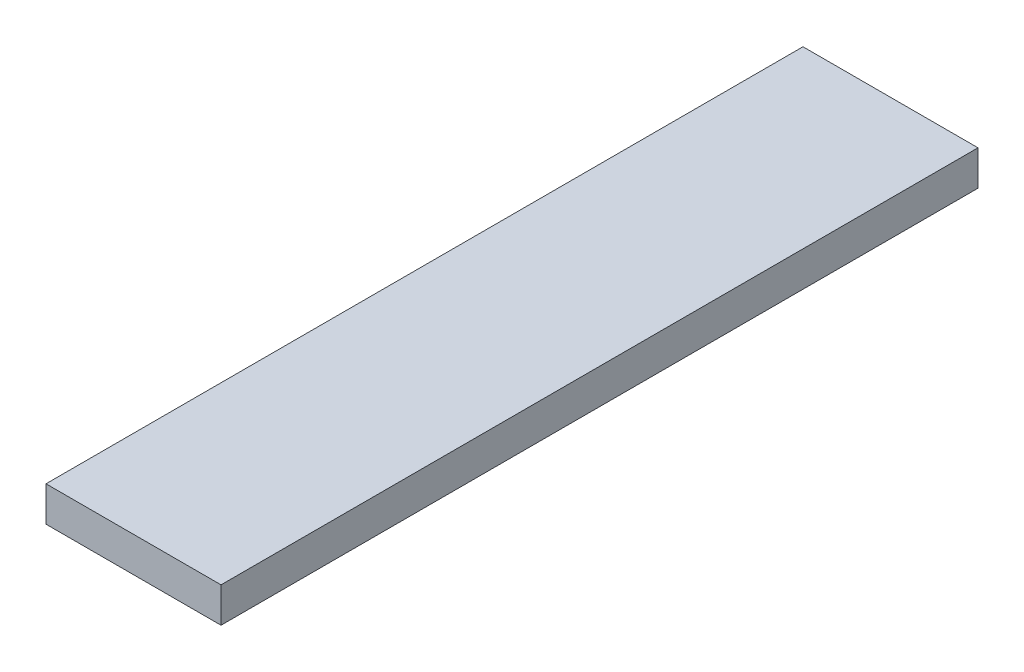
ISO-10303-21;
HEADER;
FILE_DESCRIPTION(('STEP AP214'),'2;1');
FILE_NAME('part.step','',(''),(''),'','','');
FILE_SCHEMA(('AUTOMOTIVE_DESIGN { 1 0 10303 214 1 1 1 1 }'));
ENDSEC;
DATA;
#1=APPLICATION_CONTEXT('core data for automotive mechanical design processes');
#2=APPLICATION_PROTOCOL_DEFINITION('international standard','automotive_design',2000,#1);
#3=PRODUCT_CONTEXT('',#1,'mechanical');
#4=PRODUCT('Part','Part','',(#3));
#5=PRODUCT_RELATED_PRODUCT_CATEGORY('part','',(#4));
#6=PRODUCT_DEFINITION_FORMATION('','',#4);
#7=PRODUCT_DEFINITION_CONTEXT('part definition',#1,'design');
#8=PRODUCT_DEFINITION('design','',#6,#7);
#9=PRODUCT_DEFINITION_SHAPE('','',#8);
#10=(LENGTH_UNIT() NAMED_UNIT(*) SI_UNIT(.MILLI.,.METRE.));
#11=(NAMED_UNIT(*) PLANE_ANGLE_UNIT() SI_UNIT($,.RADIAN.));
#12=(NAMED_UNIT(*) SI_UNIT($,.STERADIAN.) SOLID_ANGLE_UNIT());
#13=UNCERTAINTY_MEASURE_WITH_UNIT(LENGTH_MEASURE(1.E-05),#10,'distance_accuracy_value','');
#14=(GEOMETRIC_REPRESENTATION_CONTEXT(3) GLOBAL_UNCERTAINTY_ASSIGNED_CONTEXT((#13)) GLOBAL_UNIT_ASSIGNED_CONTEXT((#10,
#11,#12)) REPRESENTATION_CONTEXT('',''));
#15=CARTESIAN_POINT('',(0.,0.,0.));
#16=DIRECTION('',(0.,0.,1.));
#17=DIRECTION('',(1.,0.,0.));
#18=AXIS2_PLACEMENT_3D('',#15,#16,#17);
#19=CARTESIAN_POINT('',(0.,0.,-1073.96078054374));
#20=DIRECTION('',(1.,0.,0.));
#21=DIRECTION('',(0.,0.,-1.));
#22=AXIS2_PLACEMENT_3D('',#19,#20,#21);
#23=PLANE('',#22);
#24=DIRECTION('',(0.,-1.,0.));
#25=VECTOR('',#24,1.);
#26=CARTESIAN_POINT('',(0.,0.,-865.000000000024));
#27=LINE('',#26,#25);
#28=CARTESIAN_POINT('',(0.,40.,-865.000000000024));
#29=VERTEX_POINT('',#28);
#30=CARTESIAN_POINT('',(0.,0.,-865.000000000024));
#31=VERTEX_POINT('',#30);
#32=EDGE_CURVE('E44',#29,#31,#27,.T.);
#33=ORIENTED_EDGE('',*,*,#32,.F.);
#34=DIRECTION('',(0.,0.,1.));
#35=VECTOR('',#34,1.);
#36=CARTESIAN_POINT('',(0.,40.,-1073.96078054374));
#37=LINE('',#36,#35);
#38=CARTESIAN_POINT('',(0.,40.,0.));
#39=VERTEX_POINT('',#38);
#40=EDGE_CURVE('E72',#29,#39,#37,.T.);
#41=ORIENTED_EDGE('',*,*,#40,.T.);
#42=DIRECTION('',(0.,1.,0.));
#43=VECTOR('',#42,1.);
#44=CARTESIAN_POINT('',(0.,0.,0.));
#45=LINE('',#44,#43);
#46=CARTESIAN_POINT('',(0.,0.,0.));
#47=VERTEX_POINT('',#46);
#48=EDGE_CURVE('E76',#47,#39,#45,.T.);
#49=ORIENTED_EDGE('',*,*,#48,.F.);
#50=DIRECTION('',(0.,0.,1.));
#51=VECTOR('',#50,1.);
#52=CARTESIAN_POINT('',(0.,0.,-1073.96078054374));
#53=LINE('',#52,#51);
#54=EDGE_CURVE('E99',#31,#47,#53,.T.);
#55=ORIENTED_EDGE('',*,*,#54,.F.);
#56=EDGE_LOOP('',(#33,#41,#49,#55));
#57=FACE_BOUND('',#56,.T.);
#58=ADVANCED_FACE('F36',(#57),#23,.T.);
#59=CARTESIAN_POINT('',(0.,0.,-1073.96078054374));
#60=DIRECTION('',(0.,-1.,0.));
#61=DIRECTION('',(1.,0.,0.));
#62=AXIS2_PLACEMENT_3D('',#59,#60,#61);
#63=PLANE('',#62);
#64=DIRECTION('',(-1.,0.,0.));
#65=VECTOR('',#64,1.);
#66=CARTESIAN_POINT('',(0.,0.,-865.000000000024));
#67=LINE('',#66,#65);
#68=CARTESIAN_POINT('',(-200.,0.,-865.000000000024));
#69=VERTEX_POINT('',#68);
#70=EDGE_CURVE('E50',#31,#69,#67,.T.);
#71=ORIENTED_EDGE('',*,*,#70,.F.);
#72=ORIENTED_EDGE('',*,*,#54,.T.);
#73=DIRECTION('',(1.,0.,0.));
#74=VECTOR('',#73,1.);
#75=CARTESIAN_POINT('',(0.,0.,0.));
#76=LINE('',#75,#74);
#77=CARTESIAN_POINT('',(-200.,0.,0.));
#78=VERTEX_POINT('',#77);
#79=EDGE_CURVE('E81',#78,#47,#76,.T.);
#80=ORIENTED_EDGE('',*,*,#79,.F.);
#81=DIRECTION('',(0.,0.,1.));
#82=VECTOR('',#81,1.);
#83=CARTESIAN_POINT('',(-200.,0.,-1073.96078054374));
#84=LINE('',#83,#82);
#85=EDGE_CURVE('E102',#69,#78,#84,.T.);
#86=ORIENTED_EDGE('',*,*,#85,.F.);
#87=EDGE_LOOP('',(#71,#72,#80,#86));
#88=FACE_BOUND('',#87,.T.);
#89=ADVANCED_FACE('F108',(#88),#63,.T.);
#90=CARTESIAN_POINT('',(-200.,0.,-1073.96078054374));
#91=DIRECTION('',(-1.,0.,0.));
#92=DIRECTION('',(0.,0.,1.));
#93=AXIS2_PLACEMENT_3D('',#90,#91,#92);
#94=PLANE('',#93);
#95=DIRECTION('',(0.,1.,0.));
#96=VECTOR('',#95,1.);
#97=CARTESIAN_POINT('',(-200.,0.,-865.000000000024));
#98=LINE('',#97,#96);
#99=CARTESIAN_POINT('',(-200.,40.,-865.000000000024));
#100=VERTEX_POINT('',#99);
#101=EDGE_CURVE('E101',#69,#100,#98,.T.);
#102=ORIENTED_EDGE('',*,*,#101,.F.);
#103=ORIENTED_EDGE('',*,*,#85,.T.);
#104=DIRECTION('',(0.,-1.,0.));
#105=VECTOR('',#104,1.);
#106=CARTESIAN_POINT('',(-200.,0.,0.));
#107=LINE('',#106,#105);
#108=CARTESIAN_POINT('',(-200.,40.,0.));
#109=VERTEX_POINT('',#108);
#110=EDGE_CURVE('E89',#109,#78,#107,.T.);
#111=ORIENTED_EDGE('',*,*,#110,.F.);
#112=DIRECTION('',(0.,0.,1.));
#113=VECTOR('',#112,1.);
#114=CARTESIAN_POINT('',(-200.,40.,-1073.96078054374));
#115=LINE('',#114,#113);
#116=EDGE_CURVE('E80',#100,#109,#115,.T.);
#117=ORIENTED_EDGE('',*,*,#116,.F.);
#118=EDGE_LOOP('',(#102,#103,#111,#117));
#119=FACE_BOUND('',#118,.T.);
#120=ADVANCED_FACE('F106',(#119),#94,.T.);
#121=CARTESIAN_POINT('',(0.,40.,-1073.96078054374));
#122=DIRECTION('',(0.,1.,0.));
#123=DIRECTION('',(-1.,0.,0.));
#124=AXIS2_PLACEMENT_3D('',#121,#122,#123);
#125=PLANE('',#124);
#126=DIRECTION('',(1.,0.,0.));
#127=VECTOR('',#126,1.);
#128=CARTESIAN_POINT('',(0.,40.,-865.000000000024));
#129=LINE('',#128,#127);
#130=EDGE_CURVE('E12',#100,#29,#129,.T.);
#131=ORIENTED_EDGE('',*,*,#130,.F.);
#132=ORIENTED_EDGE('',*,*,#116,.T.);
#133=DIRECTION('',(-1.,0.,0.));
#134=VECTOR('',#133,1.);
#135=CARTESIAN_POINT('',(0.,40.,0.));
#136=LINE('',#135,#134);
#137=EDGE_CURVE('E83',#39,#109,#136,.T.);
#138=ORIENTED_EDGE('',*,*,#137,.F.);
#139=ORIENTED_EDGE('',*,*,#40,.F.);
#140=EDGE_LOOP('',(#131,#132,#138,#139));
#141=FACE_BOUND('',#140,.T.);
#142=ADVANCED_FACE('F84',(#141),#125,.T.);
#143=CARTESIAN_POINT('',(0.,0.,0.));
#144=DIRECTION('',(0.,0.,1.));
#145=DIRECTION('',(1.,0.,0.));
#146=AXIS2_PLACEMENT_3D('',#143,#144,#145);
#147=PLANE('',#146);
#148=ORIENTED_EDGE('',*,*,#48,.T.);
#149=ORIENTED_EDGE('',*,*,#137,.T.);
#150=ORIENTED_EDGE('',*,*,#110,.T.);
#151=ORIENTED_EDGE('',*,*,#79,.T.);
#152=EDGE_LOOP('',(#148,#149,#150,#151));
#153=FACE_BOUND('',#152,.T.);
#154=ADVANCED_FACE('F91',(#153),#147,.T.);
#155=CARTESIAN_POINT('',(-1603.56728673063,0.,-865.000000000024));
#156=DIRECTION('',(0.,0.,1.));
#157=DIRECTION('',(1.,0.,0.));
#158=AXIS2_PLACEMENT_3D('',#155,#156,#157);
#159=PLANE('',#158);
#160=ORIENTED_EDGE('',*,*,#32,.T.);
#161=ORIENTED_EDGE('',*,*,#70,.T.);
#162=ORIENTED_EDGE('',*,*,#101,.T.);
#163=ORIENTED_EDGE('',*,*,#130,.T.);
#164=EDGE_LOOP('',(#160,#161,#162,#163));
#165=FACE_BOUND('',#164,.T.);
#166=ADVANCED_FACE('F110',(#165),#159,.F.);
#167=CLOSED_SHELL('',(#58,#89,#120,#142,#154,#166));
#168=MANIFOLD_SOLID_BREP('B2',#167);
#169=ADVANCED_BREP_SHAPE_REPRESENTATION('',(#18,#168),#14);
#170=SHAPE_DEFINITION_REPRESENTATION(#9,#169);
ENDSEC;
END-ISO-10303-21;
